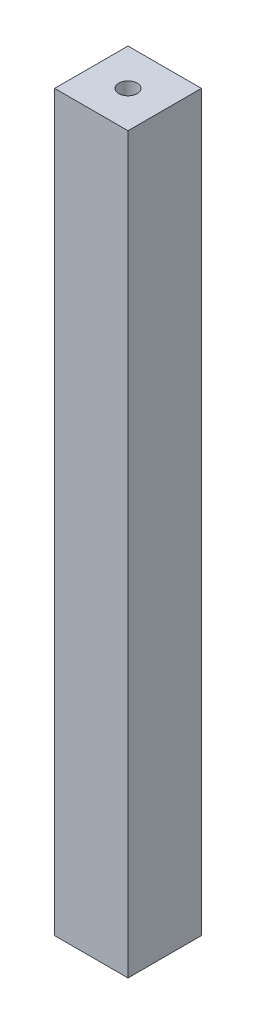
ISO-10303-21;
HEADER;
FILE_DESCRIPTION(('STEP AP214'),'2;1');
FILE_NAME('part.step','',(''),(''),'','','');
FILE_SCHEMA(('AUTOMOTIVE_DESIGN { 1 0 10303 214 1 1 1 1 }'));
ENDSEC;
DATA;
#1=APPLICATION_CONTEXT('core data for automotive mechanical design processes');
#2=APPLICATION_PROTOCOL_DEFINITION('international standard','automotive_design',2000,#1);
#3=PRODUCT_CONTEXT('',#1,'mechanical');
#4=PRODUCT('Part','Part','',(#3));
#5=PRODUCT_RELATED_PRODUCT_CATEGORY('part','',(#4));
#6=PRODUCT_DEFINITION_FORMATION('','',#4);
#7=PRODUCT_DEFINITION_CONTEXT('part definition',#1,'design');
#8=PRODUCT_DEFINITION('design','',#6,#7);
#9=PRODUCT_DEFINITION_SHAPE('','',#8);
#10=(LENGTH_UNIT() NAMED_UNIT(*) SI_UNIT(.MILLI.,.METRE.));
#11=(NAMED_UNIT(*) PLANE_ANGLE_UNIT() SI_UNIT($,.RADIAN.));
#12=(NAMED_UNIT(*) SI_UNIT($,.STERADIAN.) SOLID_ANGLE_UNIT());
#13=UNCERTAINTY_MEASURE_WITH_UNIT(LENGTH_MEASURE(1.E-05),#10,'distance_accuracy_value','');
#14=(GEOMETRIC_REPRESENTATION_CONTEXT(3) GLOBAL_UNCERTAINTY_ASSIGNED_CONTEXT((#13)) GLOBAL_UNIT_ASSIGNED_CONTEXT((#10,
#11,#12)) REPRESENTATION_CONTEXT('',''));
#15=CARTESIAN_POINT('',(0.,0.,0.));
#16=DIRECTION('',(0.,0.,1.));
#17=DIRECTION('',(1.,0.,0.));
#18=AXIS2_PLACEMENT_3D('',#15,#16,#17);
#19=CARTESIAN_POINT('',(-10.,200.,10.));
#20=DIRECTION('',(1.,0.,0.));
#21=DIRECTION('',(0.,0.,-1.));
#22=AXIS2_PLACEMENT_3D('',#19,#20,#21);
#23=PLANE('',#22);
#24=DIRECTION('',(0.,0.,1.));
#25=VECTOR('',#24,1.);
#26=CARTESIAN_POINT('',(-10.,0.,10.));
#27=LINE('',#26,#25);
#28=CARTESIAN_POINT('',(-10.,0.,-10.));
#29=VERTEX_POINT('',#28);
#30=CARTESIAN_POINT('',(-10.,0.,10.));
#31=VERTEX_POINT('',#30);
#32=EDGE_CURVE('E96',#29,#31,#27,.T.);
#33=ORIENTED_EDGE('',*,*,#32,.T.);
#34=DIRECTION('',(0.,-1.,0.));
#35=VECTOR('',#34,1.);
#36=CARTESIAN_POINT('',(-10.,200.,10.));
#37=LINE('',#36,#35);
#38=CARTESIAN_POINT('',(-10.,200.,10.));
#39=VERTEX_POINT('',#38);
#40=EDGE_CURVE('E11',#39,#31,#37,.T.);
#41=ORIENTED_EDGE('',*,*,#40,.F.);
#42=DIRECTION('',(0.,0.,1.));
#43=VECTOR('',#42,1.);
#44=CARTESIAN_POINT('',(-10.,200.,10.));
#45=LINE('',#44,#43);
#46=CARTESIAN_POINT('',(-10.,200.,-10.));
#47=VERTEX_POINT('',#46);
#48=EDGE_CURVE('E84',#47,#39,#45,.T.);
#49=ORIENTED_EDGE('',*,*,#48,.F.);
#50=DIRECTION('',(0.,-1.,0.));
#51=VECTOR('',#50,1.);
#52=CARTESIAN_POINT('',(-10.,200.,-10.));
#53=LINE('',#52,#51);
#54=EDGE_CURVE('E92',#47,#29,#53,.T.);
#55=ORIENTED_EDGE('',*,*,#54,.T.);
#56=EDGE_LOOP('',(#33,#41,#49,#55));
#57=FACE_BOUND('',#56,.T.);
#58=ADVANCED_FACE('F33',(#57),#23,.F.);
#59=CARTESIAN_POINT('',(10.,200.,10.));
#60=DIRECTION('',(0.,0.,-1.));
#61=DIRECTION('',(-1.,0.,0.));
#62=AXIS2_PLACEMENT_3D('',#59,#60,#61);
#63=PLANE('',#62);
#64=DIRECTION('',(1.,0.,0.));
#65=VECTOR('',#64,1.);
#66=CARTESIAN_POINT('',(10.,0.,10.));
#67=LINE('',#66,#65);
#68=CARTESIAN_POINT('',(10.,0.,10.));
#69=VERTEX_POINT('',#68);
#70=EDGE_CURVE('E88',#31,#69,#67,.T.);
#71=ORIENTED_EDGE('',*,*,#70,.T.);
#72=DIRECTION('',(0.,-1.,0.));
#73=VECTOR('',#72,1.);
#74=CARTESIAN_POINT('',(10.,200.,10.));
#75=LINE('',#74,#73);
#76=CARTESIAN_POINT('',(10.,200.,10.));
#77=VERTEX_POINT('',#76);
#78=EDGE_CURVE('E41',#77,#69,#75,.T.);
#79=ORIENTED_EDGE('',*,*,#78,.F.);
#80=DIRECTION('',(1.,0.,0.));
#81=VECTOR('',#80,1.);
#82=CARTESIAN_POINT('',(10.,200.,10.));
#83=LINE('',#82,#81);
#84=EDGE_CURVE('E79',#39,#77,#83,.T.);
#85=ORIENTED_EDGE('',*,*,#84,.F.);
#86=ORIENTED_EDGE('',*,*,#40,.T.);
#87=EDGE_LOOP('',(#71,#79,#85,#86));
#88=FACE_BOUND('',#87,.T.);
#89=ADVANCED_FACE('F87',(#88),#63,.F.);
#90=CARTESIAN_POINT('',(10.,200.,10.));
#91=DIRECTION('',(-1.,0.,0.));
#92=DIRECTION('',(0.,0.,1.));
#93=AXIS2_PLACEMENT_3D('',#90,#91,#92);
#94=PLANE('',#93);
#95=DIRECTION('',(0.,0.,-1.));
#96=VECTOR('',#95,1.);
#97=CARTESIAN_POINT('',(10.,0.,10.));
#98=LINE('',#97,#96);
#99=CARTESIAN_POINT('',(10.,0.,-10.));
#100=VERTEX_POINT('',#99);
#101=EDGE_CURVE('E66',#69,#100,#98,.T.);
#102=ORIENTED_EDGE('',*,*,#101,.T.);
#103=DIRECTION('',(0.,-1.,0.));
#104=VECTOR('',#103,1.);
#105=CARTESIAN_POINT('',(10.,200.,-10.));
#106=LINE('',#105,#104);
#107=CARTESIAN_POINT('',(10.,200.,-10.));
#108=VERTEX_POINT('',#107);
#109=EDGE_CURVE('E89',#108,#100,#106,.T.);
#110=ORIENTED_EDGE('',*,*,#109,.F.);
#111=DIRECTION('',(0.,0.,-1.));
#112=VECTOR('',#111,1.);
#113=CARTESIAN_POINT('',(10.,200.,10.));
#114=LINE('',#113,#112);
#115=EDGE_CURVE('E82',#77,#108,#114,.T.);
#116=ORIENTED_EDGE('',*,*,#115,.F.);
#117=ORIENTED_EDGE('',*,*,#78,.T.);
#118=EDGE_LOOP('',(#102,#110,#116,#117));
#119=FACE_BOUND('',#118,.T.);
#120=ADVANCED_FACE('F90',(#119),#94,.F.);
#121=CARTESIAN_POINT('',(10.,200.,-10.));
#122=DIRECTION('',(0.,0.,1.));
#123=DIRECTION('',(1.,0.,0.));
#124=AXIS2_PLACEMENT_3D('',#121,#122,#123);
#125=PLANE('',#124);
#126=DIRECTION('',(-1.,0.,0.));
#127=VECTOR('',#126,1.);
#128=CARTESIAN_POINT('',(10.,0.,-10.));
#129=LINE('',#128,#127);
#130=EDGE_CURVE('E72',#100,#29,#129,.T.);
#131=ORIENTED_EDGE('',*,*,#130,.T.);
#132=ORIENTED_EDGE('',*,*,#54,.F.);
#133=DIRECTION('',(-1.,0.,0.));
#134=VECTOR('',#133,1.);
#135=CARTESIAN_POINT('',(10.,200.,-10.));
#136=LINE('',#135,#134);
#137=EDGE_CURVE('E49',#108,#47,#136,.T.);
#138=ORIENTED_EDGE('',*,*,#137,.F.);
#139=ORIENTED_EDGE('',*,*,#109,.T.);
#140=EDGE_LOOP('',(#131,#132,#138,#139));
#141=FACE_BOUND('',#140,.T.);
#142=ADVANCED_FACE('F104',(#141),#125,.F.);
#143=CARTESIAN_POINT('',(0.,200.,0.));
#144=DIRECTION('',(0.,1.,0.));
#145=DIRECTION('',(0.,0.,1.));
#146=AXIS2_PLACEMENT_3D('',#143,#144,#145);
#147=PLANE('',#146);
#148=CARTESIAN_POINT('',(0.,200.,0.));
#149=DIRECTION('',(0.,1.,0.));
#150=DIRECTION('',(0.,0.,1.));
#151=AXIS2_PLACEMENT_3D('',#148,#149,#150);
#152=CIRCLE('',#151,2.5);
#153=CARTESIAN_POINT('',(0.,200.,2.5));
#154=VERTEX_POINT('',#153);
#155=EDGE_CURVE('E110',#154,#154,#152,.T.);
#156=ORIENTED_EDGE('',*,*,#155,.F.);
#157=EDGE_LOOP('',(#156));
#158=FACE_BOUND('',#157,.T.);
#159=ORIENTED_EDGE('',*,*,#48,.T.);
#160=ORIENTED_EDGE('',*,*,#84,.T.);
#161=ORIENTED_EDGE('',*,*,#115,.T.);
#162=ORIENTED_EDGE('',*,*,#137,.T.);
#163=EDGE_LOOP('',(#159,#160,#161,#162));
#164=FACE_BOUND('',#163,.T.);
#165=ADVANCED_FACE('F80',(#158,#164),#147,.T.);
#166=CARTESIAN_POINT('',(0.,0.,0.));
#167=DIRECTION('',(0.,1.,0.));
#168=DIRECTION('',(0.,0.,1.));
#169=AXIS2_PLACEMENT_3D('',#166,#167,#168);
#170=PLANE('',#169);
#171=ORIENTED_EDGE('',*,*,#32,.F.);
#172=ORIENTED_EDGE('',*,*,#130,.F.);
#173=ORIENTED_EDGE('',*,*,#101,.F.);
#174=ORIENTED_EDGE('',*,*,#70,.F.);
#175=EDGE_LOOP('',(#171,#172,#173,#174));
#176=FACE_BOUND('',#175,.T.);
#177=ADVANCED_FACE('F107',(#176),#170,.F.);
#178=CARTESIAN_POINT('',(0.,50.,0.));
#179=DIRECTION('',(0.,1.,0.));
#180=DIRECTION('',(0.,0.,1.));
#181=AXIS2_PLACEMENT_3D('',#178,#179,#180);
#182=CYLINDRICAL_SURFACE('',#181,2.5);
#183=CARTESIAN_POINT('',(0.,50.,0.));
#184=DIRECTION('',(0.,1.,0.));
#185=DIRECTION('',(0.,0.,1.));
#186=AXIS2_PLACEMENT_3D('',#183,#184,#185);
#187=CIRCLE('',#186,2.5);
#188=CARTESIAN_POINT('',(0.,50.,2.5));
#189=VERTEX_POINT('',#188);
#190=EDGE_CURVE('E99',#189,#189,#187,.T.);
#191=ORIENTED_EDGE('',*,*,#190,.F.);
#192=EDGE_LOOP('',(#191));
#193=FACE_BOUND('',#192,.T.);
#194=ORIENTED_EDGE('',*,*,#155,.T.);
#195=EDGE_LOOP('',(#194));
#196=FACE_BOUND('',#195,.T.);
#197=ADVANCED_FACE('F118',(#193,#196),#182,.F.);
#198=CARTESIAN_POINT('',(0.,50.,0.));
#199=DIRECTION('',(0.,1.,0.));
#200=DIRECTION('',(0.,0.,1.));
#201=AXIS2_PLACEMENT_3D('',#198,#199,#200);
#202=PLANE('',#201);
#203=ORIENTED_EDGE('',*,*,#190,.T.);
#204=EDGE_LOOP('',(#203));
#205=FACE_BOUND('',#204,.T.);
#206=ADVANCED_FACE('F116',(#205),#202,.T.);
#207=CLOSED_SHELL('',(#58,#89,#120,#142,#165,#177,#197,#206));
#208=MANIFOLD_SOLID_BREP('B2',#207);
#209=ADVANCED_BREP_SHAPE_REPRESENTATION('',(#18,#208),#14);
#210=SHAPE_DEFINITION_REPRESENTATION(#9,#209);
ENDSEC;
END-ISO-10303-21;
